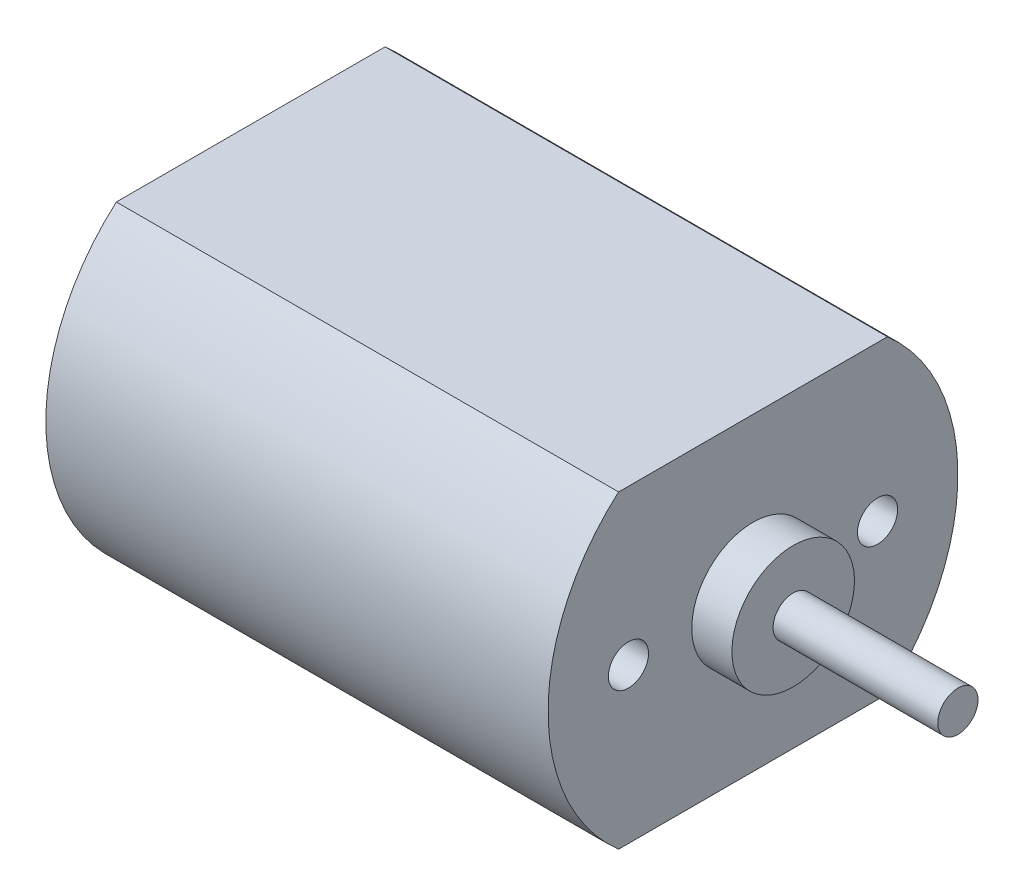
ISO-10303-21;
HEADER;
FILE_DESCRIPTION(('STEP AP214'),'2;1');
FILE_NAME('part.step','',(''),(''),'','','');
FILE_SCHEMA(('AUTOMOTIVE_DESIGN { 1 0 10303 214 1 1 1 1 }'));
ENDSEC;
DATA;
#1=APPLICATION_CONTEXT('core data for automotive mechanical design processes');
#2=APPLICATION_PROTOCOL_DEFINITION('international standard','automotive_design',2000,#1);
#3=PRODUCT_CONTEXT('',#1,'mechanical');
#4=PRODUCT('Part','Part','',(#3));
#5=PRODUCT_RELATED_PRODUCT_CATEGORY('part','',(#4));
#6=PRODUCT_DEFINITION_FORMATION('','',#4);
#7=PRODUCT_DEFINITION_CONTEXT('part definition',#1,'design');
#8=PRODUCT_DEFINITION('design','',#6,#7);
#9=PRODUCT_DEFINITION_SHAPE('','',#8);
#10=(LENGTH_UNIT() NAMED_UNIT(*) SI_UNIT(.MILLI.,.METRE.));
#11=(NAMED_UNIT(*) PLANE_ANGLE_UNIT() SI_UNIT($,.RADIAN.));
#12=(NAMED_UNIT(*) SI_UNIT($,.STERADIAN.) SOLID_ANGLE_UNIT());
#13=UNCERTAINTY_MEASURE_WITH_UNIT(LENGTH_MEASURE(1.E-05),#10,'distance_accuracy_value','');
#14=(GEOMETRIC_REPRESENTATION_CONTEXT(3) GLOBAL_UNCERTAINTY_ASSIGNED_CONTEXT((#13)) GLOBAL_UNIT_ASSIGNED_CONTEXT((#10,
#11,#12)) REPRESENTATION_CONTEXT('',''));
#15=CARTESIAN_POINT('',(0.,0.,0.));
#16=DIRECTION('',(0.,0.,1.));
#17=DIRECTION('',(1.,0.,0.));
#18=AXIS2_PLACEMENT_3D('',#15,#16,#17);
#19=CARTESIAN_POINT('',(-1.6,10.2,0.));
#20=DIRECTION('',(-1.,0.,0.));
#21=DIRECTION('',(0.,-1.,0.));
#22=AXIS2_PLACEMENT_3D('',#19,#20,#21);
#23=CYLINDRICAL_SURFACE('',#22,10.2);
#24=DIRECTION('',(1.,0.,0.));
#25=VECTOR('',#24,1.);
#26=CARTESIAN_POINT('',(-11.,17.9,6.68954408012983));
#27=LINE('',#26,#25);
#28=CARTESIAN_POINT('',(0.,17.9,6.68954408012983));
#29=VERTEX_POINT('',#28);
#30=CARTESIAN_POINT('',(25.,17.9,6.68954408012982));
#31=VERTEX_POINT('',#30);
#32=EDGE_CURVE('E159',#29,#31,#27,.T.);
#33=ORIENTED_EDGE('',*,*,#32,.F.);
#34=CARTESIAN_POINT('',(0.,10.2,0.));
#35=DIRECTION('',(-1.,0.,0.));
#36=DIRECTION('',(0.,-1.,0.));
#37=AXIS2_PLACEMENT_3D('',#34,#35,#36);
#38=CIRCLE('',#37,10.2);
#39=CARTESIAN_POINT('',(0.,2.5,6.68954408012983));
#40=VERTEX_POINT('',#39);
#41=EDGE_CURVE('E191',#40,#29,#38,.T.);
#42=ORIENTED_EDGE('',*,*,#41,.F.);
#43=DIRECTION('',(1.,0.,0.));
#44=VECTOR('',#43,1.);
#45=CARTESIAN_POINT('',(-11.,2.5,6.68954408012983));
#46=LINE('',#45,#44);
#47=CARTESIAN_POINT('',(25.,2.5,6.68954408012983));
#48=VERTEX_POINT('',#47);
#49=EDGE_CURVE('E171',#40,#48,#46,.T.);
#50=ORIENTED_EDGE('',*,*,#49,.T.);
#51=CARTESIAN_POINT('',(25.,10.2,0.));
#52=DIRECTION('',(-1.,0.,0.));
#53=DIRECTION('',(0.,-1.,0.));
#54=AXIS2_PLACEMENT_3D('',#51,#52,#53);
#55=CIRCLE('',#54,10.2);
#56=EDGE_CURVE('E164',#48,#31,#55,.T.);
#57=ORIENTED_EDGE('',*,*,#56,.T.);
#58=EDGE_LOOP('',(#33,#42,#50,#57));
#59=FACE_BOUND('',#58,.T.);
#60=ADVANCED_FACE('F47',(#59),#23,.T.);
#61=DIRECTION('',(1.,0.,0.));
#62=VECTOR('',#61,1.);
#63=CARTESIAN_POINT('',(-11.,17.9,-6.68954408012983));
#64=LINE('',#63,#62);
#65=CARTESIAN_POINT('',(0.,17.9,-6.68954408012983));
#66=VERTEX_POINT('',#65);
#67=CARTESIAN_POINT('',(25.,17.9,-6.68954408012983));
#68=VERTEX_POINT('',#67);
#69=EDGE_CURVE('E160',#66,#68,#64,.T.);
#70=ORIENTED_EDGE('',*,*,#69,.T.);
#71=CARTESIAN_POINT('',(25.,2.5,-6.68954408012982));
#72=VERTEX_POINT('',#71);
#73=EDGE_CURVE('E163',#68,#72,#55,.T.);
#74=ORIENTED_EDGE('',*,*,#73,.T.);
#75=DIRECTION('',(1.,0.,0.));
#76=VECTOR('',#75,1.);
#77=CARTESIAN_POINT('',(-11.,2.5,-6.68954408012983));
#78=LINE('',#77,#76);
#79=CARTESIAN_POINT('',(0.,2.5,-6.68954408012983));
#80=VERTEX_POINT('',#79);
#81=EDGE_CURVE('E167',#80,#72,#78,.T.);
#82=ORIENTED_EDGE('',*,*,#81,.F.);
#83=EDGE_CURVE('E193',#66,#80,#38,.T.);
#84=ORIENTED_EDGE('',*,*,#83,.F.);
#85=EDGE_LOOP('',(#70,#74,#82,#84));
#86=FACE_BOUND('',#85,.T.);
#87=ADVANCED_FACE('F204',(#86),#23,.T.);
#88=CARTESIAN_POINT('',(0.,7.15,0.));
#89=DIRECTION('',(-1.,0.,0.));
#90=DIRECTION('',(0.,-1.,0.));
#91=AXIS2_PLACEMENT_3D('',#88,#89,#90);
#92=PLANE('',#91);
#93=CARTESIAN_POINT('',(0.,10.2,0.));
#94=DIRECTION('',(-1.,0.,0.));
#95=DIRECTION('',(0.,-1.,0.));
#96=AXIS2_PLACEMENT_3D('',#93,#94,#95);
#97=CIRCLE('',#96,9.7);
#98=CARTESIAN_POINT('',(0.,3.,6.5));
#99=VERTEX_POINT('',#98);
#100=CARTESIAN_POINT('',(0.,17.4,6.5));
#101=VERTEX_POINT('',#100);
#102=EDGE_CURVE('E110',#99,#101,#97,.T.);
#103=ORIENTED_EDGE('',*,*,#102,.F.);
#104=DIRECTION('',(0.,0.,1.));
#105=VECTOR('',#104,1.);
#106=CARTESIAN_POINT('',(0.,3.,6.5));
#107=LINE('',#106,#105);
#108=CARTESIAN_POINT('',(0.,3.,-6.5));
#109=VERTEX_POINT('',#108);
#110=EDGE_CURVE('E132',#109,#99,#107,.T.);
#111=ORIENTED_EDGE('',*,*,#110,.F.);
#112=CARTESIAN_POINT('',(0.,10.2,0.));
#113=DIRECTION('',(-1.,0.,0.));
#114=DIRECTION('',(0.,-1.,0.));
#115=AXIS2_PLACEMENT_3D('',#112,#113,#114);
#116=CIRCLE('',#115,9.7);
#117=CARTESIAN_POINT('',(0.,17.4,-6.5));
#118=VERTEX_POINT('',#117);
#119=EDGE_CURVE('E140',#118,#109,#116,.T.);
#120=ORIENTED_EDGE('',*,*,#119,.F.);
#121=DIRECTION('',(0.,0.,-1.));
#122=VECTOR('',#121,1.);
#123=CARTESIAN_POINT('',(0.,17.4,-6.5));
#124=LINE('',#123,#122);
#125=EDGE_CURVE('E117',#101,#118,#124,.T.);
#126=ORIENTED_EDGE('',*,*,#125,.F.);
#127=EDGE_LOOP('',(#103,#111,#120,#126));
#128=FACE_BOUND('',#127,.T.);
#129=DIRECTION('',(0.,0.,1.));
#130=VECTOR('',#129,1.);
#131=CARTESIAN_POINT('',(0.,17.9,0.));
#132=LINE('',#131,#130);
#133=EDGE_CURVE('E166',#66,#29,#132,.T.);
#134=ORIENTED_EDGE('',*,*,#133,.F.);
#135=ORIENTED_EDGE('',*,*,#83,.T.);
#136=DIRECTION('',(0.,0.,-1.));
#137=VECTOR('',#136,1.);
#138=CARTESIAN_POINT('',(0.,2.5,0.));
#139=LINE('',#138,#137);
#140=EDGE_CURVE('E170',#40,#80,#139,.T.);
#141=ORIENTED_EDGE('',*,*,#140,.F.);
#142=ORIENTED_EDGE('',*,*,#41,.T.);
#143=EDGE_LOOP('',(#134,#135,#141,#142));
#144=FACE_BOUND('',#143,.T.);
#145=ADVANCED_FACE('F217',(#128,#144),#92,.T.);
#146=CARTESIAN_POINT('',(35.2,10.2,0.));
#147=DIRECTION('',(1.,0.,0.));
#148=DIRECTION('',(0.,1.,0.));
#149=AXIS2_PLACEMENT_3D('',#146,#147,#148);
#150=PLANE('',#149);
#151=CARTESIAN_POINT('',(35.2,10.2,0.));
#152=DIRECTION('',(-1.,0.,0.));
#153=DIRECTION('',(0.,-1.,0.));
#154=AXIS2_PLACEMENT_3D('',#151,#152,#153);
#155=CIRCLE('',#154,1.);
#156=CARTESIAN_POINT('',(35.2,9.2,0.));
#157=VERTEX_POINT('',#156);
#158=EDGE_CURVE('E188',#157,#157,#155,.T.);
#159=ORIENTED_EDGE('',*,*,#158,.F.);
#160=EDGE_LOOP('',(#159));
#161=FACE_BOUND('',#160,.T.);
#162=ADVANCED_FACE('F219',(#161),#150,.T.);
#163=CARTESIAN_POINT('',(-1.6,10.2,0.));
#164=DIRECTION('',(-1.,0.,0.));
#165=DIRECTION('',(0.,-1.,0.));
#166=AXIS2_PLACEMENT_3D('',#163,#164,#165);
#167=CYLINDRICAL_SURFACE('',#166,1.);
#168=ORIENTED_EDGE('',*,*,#158,.T.);
#169=EDGE_LOOP('',(#168));
#170=FACE_BOUND('',#169,.T.);
#171=CARTESIAN_POINT('',(27.,10.2,0.));
#172=DIRECTION('',(-1.,0.,0.));
#173=DIRECTION('',(0.,-1.,0.));
#174=AXIS2_PLACEMENT_3D('',#171,#172,#173);
#175=CIRCLE('',#174,1.);
#176=CARTESIAN_POINT('',(27.,9.2,0.));
#177=VERTEX_POINT('',#176);
#178=EDGE_CURVE('E185',#177,#177,#175,.T.);
#179=ORIENTED_EDGE('',*,*,#178,.F.);
#180=EDGE_LOOP('',(#179));
#181=FACE_BOUND('',#180,.T.);
#182=ADVANCED_FACE('F226',(#170,#181),#167,.T.);
#183=CARTESIAN_POINT('',(27.,9.2,0.));
#184=DIRECTION('',(1.,0.,0.));
#185=DIRECTION('',(0.,1.,0.));
#186=AXIS2_PLACEMENT_3D('',#183,#184,#185);
#187=PLANE('',#186);
#188=ORIENTED_EDGE('',*,*,#178,.T.);
#189=EDGE_LOOP('',(#188));
#190=FACE_BOUND('',#189,.T.);
#191=CARTESIAN_POINT('',(27.,10.2,0.));
#192=DIRECTION('',(-1.,0.,0.));
#193=DIRECTION('',(0.,-1.,0.));
#194=AXIS2_PLACEMENT_3D('',#191,#192,#193);
#195=CIRCLE('',#194,3.05);
#196=CARTESIAN_POINT('',(27.,7.15,0.));
#197=VERTEX_POINT('',#196);
#198=EDGE_CURVE('E182',#197,#197,#195,.T.);
#199=ORIENTED_EDGE('',*,*,#198,.F.);
#200=EDGE_LOOP('',(#199));
#201=FACE_BOUND('',#200,.T.);
#202=ADVANCED_FACE('F259',(#190,#201),#187,.T.);
#203=CARTESIAN_POINT('',(-1.6,10.2,0.));
#204=DIRECTION('',(-1.,0.,0.));
#205=DIRECTION('',(0.,-1.,0.));
#206=AXIS2_PLACEMENT_3D('',#203,#204,#205);
#207=CYLINDRICAL_SURFACE('',#206,3.05);
#208=ORIENTED_EDGE('',*,*,#198,.T.);
#209=EDGE_LOOP('',(#208));
#210=FACE_BOUND('',#209,.T.);
#211=CARTESIAN_POINT('',(25.,10.2,0.));
#212=DIRECTION('',(-1.,0.,0.));
#213=DIRECTION('',(0.,-1.,0.));
#214=AXIS2_PLACEMENT_3D('',#211,#212,#213);
#215=CIRCLE('',#214,3.05);
#216=CARTESIAN_POINT('',(25.,7.15,0.));
#217=VERTEX_POINT('',#216);
#218=EDGE_CURVE('E176',#217,#217,#215,.T.);
#219=ORIENTED_EDGE('',*,*,#218,.F.);
#220=EDGE_LOOP('',(#219));
#221=FACE_BOUND('',#220,.T.);
#222=ADVANCED_FACE('F269',(#210,#221),#207,.T.);
#223=CARTESIAN_POINT('',(25.,7.15,0.));
#224=DIRECTION('',(1.,0.,0.));
#225=DIRECTION('',(0.,1.,0.));
#226=AXIS2_PLACEMENT_3D('',#223,#224,#225);
#227=PLANE('',#226);
#228=CARTESIAN_POINT('',(25.,10.2,6.2));
#229=DIRECTION('',(1.,0.,0.));
#230=DIRECTION('',(0.,1.,0.));
#231=AXIS2_PLACEMENT_3D('',#228,#229,#230);
#232=CIRCLE('',#231,1.);
#233=CARTESIAN_POINT('',(25.,11.2,6.2));
#234=VERTEX_POINT('',#233);
#235=EDGE_CURVE('E148',#234,#234,#232,.T.);
#236=ORIENTED_EDGE('',*,*,#235,.F.);
#237=EDGE_LOOP('',(#236));
#238=FACE_BOUND('',#237,.T.);
#239=CARTESIAN_POINT('',(25.,10.2,-6.2));
#240=DIRECTION('',(1.,0.,0.));
#241=DIRECTION('',(0.,-1.,0.));
#242=AXIS2_PLACEMENT_3D('',#239,#240,#241);
#243=CIRCLE('',#242,1.);
#244=CARTESIAN_POINT('',(25.,9.2,-6.2));
#245=VERTEX_POINT('',#244);
#246=EDGE_CURVE('E152',#245,#245,#243,.T.);
#247=ORIENTED_EDGE('',*,*,#246,.F.);
#248=EDGE_LOOP('',(#247));
#249=FACE_BOUND('',#248,.T.);
#250=DIRECTION('',(0.,0.,-1.));
#251=VECTOR('',#250,1.);
#252=CARTESIAN_POINT('',(25.,17.9,6.68954408012983));
#253=LINE('',#252,#251);
#254=EDGE_CURVE('E155',#31,#68,#253,.T.);
#255=ORIENTED_EDGE('',*,*,#254,.F.);
#256=ORIENTED_EDGE('',*,*,#56,.F.);
#257=DIRECTION('',(0.,0.,1.));
#258=VECTOR('',#257,1.);
#259=CARTESIAN_POINT('',(25.,2.5,6.68954408012983));
#260=LINE('',#259,#258);
#261=EDGE_CURVE('E169',#72,#48,#260,.T.);
#262=ORIENTED_EDGE('',*,*,#261,.F.);
#263=ORIENTED_EDGE('',*,*,#73,.F.);
#264=EDGE_LOOP('',(#255,#256,#262,#263));
#265=FACE_BOUND('',#264,.T.);
#266=ORIENTED_EDGE('',*,*,#218,.T.);
#267=EDGE_LOOP('',(#266));
#268=FACE_BOUND('',#267,.T.);
#269=ADVANCED_FACE('F208',(#238,#249,#265,#268),#227,.T.);
#270=CARTESIAN_POINT('',(-11.,2.5,6.68954408012983));
#271=DIRECTION('',(0.,1.,0.));
#272=DIRECTION('',(-1.,0.,0.));
#273=AXIS2_PLACEMENT_3D('',#270,#271,#272);
#274=PLANE('',#273);
#275=ORIENTED_EDGE('',*,*,#140,.T.);
#276=ORIENTED_EDGE('',*,*,#81,.T.);
#277=ORIENTED_EDGE('',*,*,#261,.T.);
#278=ORIENTED_EDGE('',*,*,#49,.F.);
#279=EDGE_LOOP('',(#275,#276,#277,#278));
#280=FACE_BOUND('',#279,.T.);
#281=ADVANCED_FACE('F212',(#280),#274,.F.);
#282=CARTESIAN_POINT('',(-11.,17.9,6.68954408012983));
#283=DIRECTION('',(0.,-1.,0.));
#284=DIRECTION('',(1.,0.,0.));
#285=AXIS2_PLACEMENT_3D('',#282,#283,#284);
#286=PLANE('',#285);
#287=ORIENTED_EDGE('',*,*,#133,.T.);
#288=ORIENTED_EDGE('',*,*,#32,.T.);
#289=ORIENTED_EDGE('',*,*,#254,.T.);
#290=ORIENTED_EDGE('',*,*,#69,.F.);
#291=EDGE_LOOP('',(#287,#288,#289,#290));
#292=FACE_BOUND('',#291,.T.);
#293=ADVANCED_FACE('F216',(#292),#286,.F.);
#294=CARTESIAN_POINT('',(17.,10.2,-6.2));
#295=DIRECTION('',(1.,0.,0.));
#296=DIRECTION('',(0.,1.,0.));
#297=AXIS2_PLACEMENT_3D('',#294,#295,#296);
#298=CYLINDRICAL_SURFACE('',#297,1.);
#299=CARTESIAN_POINT('',(17.,10.2,-6.2));
#300=DIRECTION('',(1.,0.,0.));
#301=DIRECTION('',(0.,-1.,0.));
#302=AXIS2_PLACEMENT_3D('',#299,#300,#301);
#303=CIRCLE('',#302,1.);
#304=CARTESIAN_POINT('',(17.,9.2,-6.2));
#305=VERTEX_POINT('',#304);
#306=EDGE_CURVE('E151',#305,#305,#303,.T.);
#307=ORIENTED_EDGE('',*,*,#306,.F.);
#308=EDGE_LOOP('',(#307));
#309=FACE_BOUND('',#308,.T.);
#310=ORIENTED_EDGE('',*,*,#246,.T.);
#311=EDGE_LOOP('',(#310));
#312=FACE_BOUND('',#311,.T.);
#313=ADVANCED_FACE('F305',(#309,#312),#298,.F.);
#314=CARTESIAN_POINT('',(17.,10.2,-6.2));
#315=DIRECTION('',(-1.,0.,0.));
#316=DIRECTION('',(0.,-1.,0.));
#317=AXIS2_PLACEMENT_3D('',#314,#315,#316);
#318=PLANE('',#317);
#319=ORIENTED_EDGE('',*,*,#306,.T.);
#320=EDGE_LOOP('',(#319));
#321=FACE_BOUND('',#320,.T.);
#322=ADVANCED_FACE('F314',(#321),#318,.F.);
#323=CARTESIAN_POINT('',(17.,10.2,6.2));
#324=DIRECTION('',(1.,0.,0.));
#325=DIRECTION('',(0.,1.,0.));
#326=AXIS2_PLACEMENT_3D('',#323,#324,#325);
#327=CYLINDRICAL_SURFACE('',#326,1.);
#328=CARTESIAN_POINT('',(17.,10.2,6.2));
#329=DIRECTION('',(1.,0.,0.));
#330=DIRECTION('',(0.,1.,0.));
#331=AXIS2_PLACEMENT_3D('',#328,#329,#330);
#332=CIRCLE('',#331,1.);
#333=CARTESIAN_POINT('',(17.,11.2,6.2));
#334=VERTEX_POINT('',#333);
#335=EDGE_CURVE('E135',#334,#334,#332,.T.);
#336=ORIENTED_EDGE('',*,*,#335,.F.);
#337=EDGE_LOOP('',(#336));
#338=FACE_BOUND('',#337,.T.);
#339=ORIENTED_EDGE('',*,*,#235,.T.);
#340=EDGE_LOOP('',(#339));
#341=FACE_BOUND('',#340,.T.);
#342=ADVANCED_FACE('F324',(#338,#341),#327,.F.);
#343=CARTESIAN_POINT('',(17.,10.2,6.2));
#344=DIRECTION('',(1.,0.,0.));
#345=DIRECTION('',(0.,1.,0.));
#346=AXIS2_PLACEMENT_3D('',#343,#344,#345);
#347=PLANE('',#346);
#348=ORIENTED_EDGE('',*,*,#335,.T.);
#349=EDGE_LOOP('',(#348));
#350=FACE_BOUND('',#349,.T.);
#351=ADVANCED_FACE('F334',(#350),#347,.T.);
#352=CARTESIAN_POINT('',(0.6,10.2,0.));
#353=DIRECTION('',(-1.,0.,0.));
#354=DIRECTION('',(0.,-1.,0.));
#355=AXIS2_PLACEMENT_3D('',#352,#353,#354);
#356=CYLINDRICAL_SURFACE('',#355,9.7);
#357=ORIENTED_EDGE('',*,*,#102,.T.);
#358=DIRECTION('',(-1.,0.,0.));
#359=VECTOR('',#358,1.);
#360=CARTESIAN_POINT('',(0.599999999999999,17.4,6.5));
#361=LINE('',#360,#359);
#362=CARTESIAN_POINT('',(0.599999999999999,17.4,6.5));
#363=VERTEX_POINT('',#362);
#364=EDGE_CURVE('E113',#363,#101,#361,.T.);
#365=ORIENTED_EDGE('',*,*,#364,.F.);
#366=CARTESIAN_POINT('',(0.6,10.2,0.));
#367=DIRECTION('',(-1.,0.,0.));
#368=DIRECTION('',(0.,-1.,0.));
#369=AXIS2_PLACEMENT_3D('',#366,#367,#368);
#370=CIRCLE('',#369,9.7);
#371=CARTESIAN_POINT('',(0.6,3.,6.5));
#372=VERTEX_POINT('',#371);
#373=EDGE_CURVE('E51',#372,#363,#370,.T.);
#374=ORIENTED_EDGE('',*,*,#373,.F.);
#375=DIRECTION('',(-1.,0.,0.));
#376=VECTOR('',#375,1.);
#377=CARTESIAN_POINT('',(0.6,3.,6.5));
#378=LINE('',#377,#376);
#379=EDGE_CURVE('E130',#372,#99,#378,.T.);
#380=ORIENTED_EDGE('',*,*,#379,.T.);
#381=EDGE_LOOP('',(#357,#365,#374,#380));
#382=FACE_BOUND('',#381,.T.);
#383=ADVANCED_FACE('F114',(#382),#356,.F.);
#384=CARTESIAN_POINT('',(0.6,3.,6.5));
#385=DIRECTION('',(0.,-1.,0.));
#386=DIRECTION('',(1.,0.,0.));
#387=AXIS2_PLACEMENT_3D('',#384,#385,#386);
#388=PLANE('',#387);
#389=ORIENTED_EDGE('',*,*,#110,.T.);
#390=ORIENTED_EDGE('',*,*,#379,.F.);
#391=DIRECTION('',(0.,0.,1.));
#392=VECTOR('',#391,1.);
#393=CARTESIAN_POINT('',(0.6,3.,6.5));
#394=LINE('',#393,#392);
#395=CARTESIAN_POINT('',(0.6,3.,-6.5));
#396=VERTEX_POINT('',#395);
#397=EDGE_CURVE('E12',#396,#372,#394,.T.);
#398=ORIENTED_EDGE('',*,*,#397,.F.);
#399=DIRECTION('',(-1.,0.,0.));
#400=VECTOR('',#399,1.);
#401=CARTESIAN_POINT('',(0.6,3.,-6.5));
#402=LINE('',#401,#400);
#403=EDGE_CURVE('E128',#396,#109,#402,.T.);
#404=ORIENTED_EDGE('',*,*,#403,.T.);
#405=EDGE_LOOP('',(#389,#390,#398,#404));
#406=FACE_BOUND('',#405,.T.);
#407=ADVANCED_FACE('F127',(#406),#388,.F.);
#408=CARTESIAN_POINT('',(0.6,10.2,0.));
#409=DIRECTION('',(-1.,0.,0.));
#410=DIRECTION('',(0.,-1.,0.));
#411=AXIS2_PLACEMENT_3D('',#408,#409,#410);
#412=CYLINDRICAL_SURFACE('',#411,9.7);
#413=ORIENTED_EDGE('',*,*,#119,.T.);
#414=ORIENTED_EDGE('',*,*,#403,.F.);
#415=CARTESIAN_POINT('',(0.6,10.2,0.));
#416=DIRECTION('',(-1.,0.,0.));
#417=DIRECTION('',(0.,-1.,0.));
#418=AXIS2_PLACEMENT_3D('',#415,#416,#417);
#419=CIRCLE('',#418,9.7);
#420=CARTESIAN_POINT('',(0.599999999999999,17.4,-6.5));
#421=VERTEX_POINT('',#420);
#422=EDGE_CURVE('E57',#421,#396,#419,.T.);
#423=ORIENTED_EDGE('',*,*,#422,.F.);
#424=DIRECTION('',(-1.,0.,0.));
#425=VECTOR('',#424,1.);
#426=CARTESIAN_POINT('',(0.599999999999999,17.4,-6.5));
#427=LINE('',#426,#425);
#428=EDGE_CURVE('E65',#421,#118,#427,.T.);
#429=ORIENTED_EDGE('',*,*,#428,.T.);
#430=EDGE_LOOP('',(#413,#414,#423,#429));
#431=FACE_BOUND('',#430,.T.);
#432=ADVANCED_FACE('F361',(#431),#412,.F.);
#433=CARTESIAN_POINT('',(0.599999999999999,17.4,-6.5));
#434=DIRECTION('',(0.,1.,0.));
#435=DIRECTION('',(-1.,0.,0.));
#436=AXIS2_PLACEMENT_3D('',#433,#434,#435);
#437=PLANE('',#436);
#438=ORIENTED_EDGE('',*,*,#125,.T.);
#439=ORIENTED_EDGE('',*,*,#428,.F.);
#440=DIRECTION('',(0.,0.,-1.));
#441=VECTOR('',#440,1.);
#442=CARTESIAN_POINT('',(0.599999999999999,17.4,-6.5));
#443=LINE('',#442,#441);
#444=EDGE_CURVE('E120',#363,#421,#443,.T.);
#445=ORIENTED_EDGE('',*,*,#444,.F.);
#446=ORIENTED_EDGE('',*,*,#364,.T.);
#447=EDGE_LOOP('',(#438,#439,#445,#446));
#448=FACE_BOUND('',#447,.T.);
#449=ADVANCED_FACE('F121',(#448),#437,.F.);
#450=CARTESIAN_POINT('',(0.6,10.2,0.));
#451=DIRECTION('',(-1.,0.,0.));
#452=DIRECTION('',(0.,-1.,0.));
#453=AXIS2_PLACEMENT_3D('',#450,#451,#452);
#454=PLANE('',#453);
#455=ORIENTED_EDGE('',*,*,#373,.T.);
#456=ORIENTED_EDGE('',*,*,#444,.T.);
#457=ORIENTED_EDGE('',*,*,#422,.T.);
#458=ORIENTED_EDGE('',*,*,#397,.T.);
#459=EDGE_LOOP('',(#455,#456,#457,#458));
#460=FACE_BOUND('',#459,.T.);
#461=ADVANCED_FACE('F49',(#460),#454,.T.);
#462=CLOSED_SHELL('',(#60,#87,#145,#162,#182,#202,#222,#269,#281,#293,#313,#322,#342,#351,#383,
#407,#432,#449,#461));
#463=MANIFOLD_SOLID_BREP('B2',#462);
#464=CARTESIAN_POINT('',(-1.6,10.2,0.));
#465=DIRECTION('',(-1.,0.,0.));
#466=DIRECTION('',(0.,-1.,0.));
#467=AXIS2_PLACEMENT_3D('',#464,#465,#466);
#468=PLANE('',#467);
#469=CARTESIAN_POINT('',(-1.6,10.2,0.));
#470=DIRECTION('',(-1.,0.,0.));
#471=DIRECTION('',(0.,-1.,0.));
#472=AXIS2_PLACEMENT_3D('',#469,#470,#471);
#473=CIRCLE('',#472,3.05);
#474=CARTESIAN_POINT('',(-1.6,7.15,0.));
#475=VERTEX_POINT('',#474);
#476=EDGE_CURVE('E46',#475,#475,#473,.T.);
#477=ORIENTED_EDGE('',*,*,#476,.T.);
#478=EDGE_LOOP('',(#477));
#479=FACE_BOUND('',#478,.T.);
#480=ADVANCED_FACE('F403',(#479),#468,.T.);
#481=CARTESIAN_POINT('',(-1.6,10.2,0.));
#482=DIRECTION('',(-1.,0.,0.));
#483=DIRECTION('',(0.,-1.,0.));
#484=AXIS2_PLACEMENT_3D('',#481,#482,#483);
#485=CYLINDRICAL_SURFACE('',#484,3.05);
#486=CARTESIAN_POINT('',(0.,10.2,0.));
#487=DIRECTION('',(-1.,0.,0.));
#488=DIRECTION('',(0.,-1.,0.));
#489=AXIS2_PLACEMENT_3D('',#486,#487,#488);
#490=CIRCLE('',#489,3.05);
#491=CARTESIAN_POINT('',(0.,7.15,0.));
#492=VERTEX_POINT('',#491);
#493=EDGE_CURVE('E410',#492,#492,#490,.F.);
#494=ORIENTED_EDGE('',*,*,#493,.F.);
#495=EDGE_LOOP('',(#494));
#496=FACE_BOUND('',#495,.T.);
#497=ORIENTED_EDGE('',*,*,#476,.F.);
#498=EDGE_LOOP('',(#497));
#499=FACE_BOUND('',#498,.T.);
#500=ADVANCED_FACE('F405',(#496,#499),#485,.T.);
#501=CARTESIAN_POINT('',(0.,10.2,0.));
#502=DIRECTION('',(-1.,0.,0.));
#503=DIRECTION('',(0.,-1.,0.));
#504=AXIS2_PLACEMENT_3D('',#501,#502,#503);
#505=PLANE('',#504);
#506=ORIENTED_EDGE('',*,*,#493,.T.);
#507=EDGE_LOOP('',(#506));
#508=FACE_BOUND('',#507,.T.);
#509=ADVANCED_FACE('F416',(#508),#505,.F.);
#510=CLOSED_SHELL('',(#480,#500,#509));
#511=MANIFOLD_SOLID_BREP('B6',#510);
#512=ADVANCED_BREP_SHAPE_REPRESENTATION('',(#18,#463,#511),#14);
#513=SHAPE_DEFINITION_REPRESENTATION(#9,#512);
ENDSEC;
END-ISO-10303-21;
